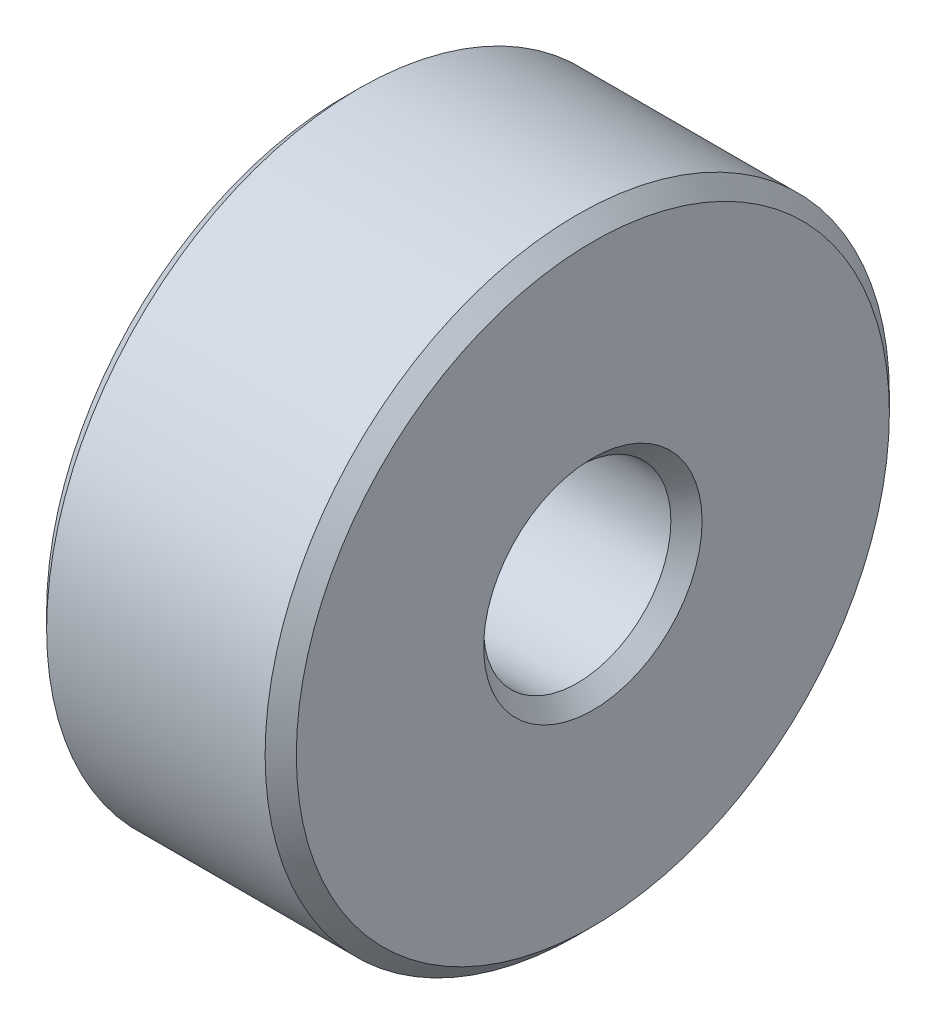
ISO-10303-21;
HEADER;
FILE_DESCRIPTION(('STEP AP214'),'2;1');
FILE_NAME('part.step','',(''),(''),'','','');
FILE_SCHEMA(('AUTOMOTIVE_DESIGN { 1 0 10303 214 1 1 1 1 }'));
ENDSEC;
DATA;
#1=APPLICATION_CONTEXT('core data for automotive mechanical design processes');
#2=APPLICATION_PROTOCOL_DEFINITION('international standard','automotive_design',2000,#1);
#3=PRODUCT_CONTEXT('',#1,'mechanical');
#4=PRODUCT('Part','Part','',(#3));
#5=PRODUCT_RELATED_PRODUCT_CATEGORY('part','',(#4));
#6=PRODUCT_DEFINITION_FORMATION('','',#4);
#7=PRODUCT_DEFINITION_CONTEXT('part definition',#1,'design');
#8=PRODUCT_DEFINITION('design','',#6,#7);
#9=PRODUCT_DEFINITION_SHAPE('','',#8);
#10=(LENGTH_UNIT() NAMED_UNIT(*) SI_UNIT(.MILLI.,.METRE.));
#11=(NAMED_UNIT(*) PLANE_ANGLE_UNIT() SI_UNIT($,.RADIAN.));
#12=(NAMED_UNIT(*) SI_UNIT($,.STERADIAN.) SOLID_ANGLE_UNIT());
#13=UNCERTAINTY_MEASURE_WITH_UNIT(LENGTH_MEASURE(1.E-05),#10,'distance_accuracy_value','');
#14=(GEOMETRIC_REPRESENTATION_CONTEXT(3) GLOBAL_UNCERTAINTY_ASSIGNED_CONTEXT((#13)) GLOBAL_UNIT_ASSIGNED_CONTEXT((#10,
#11,#12)) REPRESENTATION_CONTEXT('',''));
#15=CARTESIAN_POINT('',(0.,0.,0.));
#16=DIRECTION('',(0.,0.,1.));
#17=DIRECTION('',(1.,0.,0.));
#18=AXIS2_PLACEMENT_3D('',#15,#16,#17);
#19=CARTESIAN_POINT('',(2.,0.,0.));
#20=DIRECTION('',(1.,0.,0.));
#21=DIRECTION('',(0.,0.,-1.));
#22=AXIS2_PLACEMENT_3D('',#19,#20,#21);
#23=PLANE('',#22);
#24=CARTESIAN_POINT('',(2.,0.,0.));
#25=DIRECTION('',(1.,0.,0.));
#26=DIRECTION('',(0.,0.,-1.));
#27=AXIS2_PLACEMENT_3D('',#24,#25,#26);
#28=CIRCLE('',#27,1.75);
#29=CARTESIAN_POINT('',(2.,0.,-1.75));
#30=VERTEX_POINT('',#29);
#31=EDGE_CURVE('E55',#30,#30,#28,.F.);
#32=ORIENTED_EDGE('',*,*,#31,.T.);
#33=EDGE_LOOP('',(#32));
#34=FACE_BOUND('',#33,.T.);
#35=CARTESIAN_POINT('',(2.,0.,0.));
#36=DIRECTION('',(1.,0.,0.));
#37=DIRECTION('',(0.,0.,-1.));
#38=AXIS2_PLACEMENT_3D('',#35,#36,#37);
#39=CIRCLE('',#38,4.75);
#40=CARTESIAN_POINT('',(2.,0.,-4.75));
#41=VERTEX_POINT('',#40);
#42=EDGE_CURVE('E60',#41,#41,#39,.T.);
#43=ORIENTED_EDGE('',*,*,#42,.T.);
#44=EDGE_LOOP('',(#43));
#45=FACE_BOUND('',#44,.T.);
#46=ADVANCED_FACE('F39',(#34,#45),#23,.T.);
#47=CARTESIAN_POINT('',(-2.,0.,0.));
#48=DIRECTION('',(1.,0.,0.));
#49=DIRECTION('',(0.,0.,-1.));
#50=AXIS2_PLACEMENT_3D('',#47,#48,#49);
#51=PLANE('',#50);
#52=CARTESIAN_POINT('',(-2.,0.,0.));
#53=DIRECTION('',(1.,0.,0.));
#54=DIRECTION('',(0.,0.,-1.));
#55=AXIS2_PLACEMENT_3D('',#52,#53,#54);
#56=CIRCLE('',#55,4.75);
#57=CARTESIAN_POINT('',(-2.,0.,-4.75));
#58=VERTEX_POINT('',#57);
#59=EDGE_CURVE('E10',#58,#58,#56,.F.);
#60=ORIENTED_EDGE('',*,*,#59,.T.);
#61=EDGE_LOOP('',(#60));
#62=FACE_BOUND('',#61,.T.);
#63=CARTESIAN_POINT('',(-2.,0.,0.));
#64=DIRECTION('',(1.,0.,0.));
#65=DIRECTION('',(0.,0.,-1.));
#66=AXIS2_PLACEMENT_3D('',#63,#64,#65);
#67=CIRCLE('',#66,1.5);
#68=CARTESIAN_POINT('',(-2.,0.,-1.5));
#69=VERTEX_POINT('',#68);
#70=EDGE_CURVE('E66',#69,#69,#67,.T.);
#71=ORIENTED_EDGE('',*,*,#70,.T.);
#72=EDGE_LOOP('',(#71));
#73=FACE_BOUND('',#72,.T.);
#74=ADVANCED_FACE('F70',(#62,#73),#51,.F.);
#75=CARTESIAN_POINT('',(2.,0.,0.));
#76=DIRECTION('',(-1.,0.,0.));
#77=DIRECTION('',(0.,0.,1.));
#78=AXIS2_PLACEMENT_3D('',#75,#76,#77);
#79=CYLINDRICAL_SURFACE('',#78,5.);
#80=CARTESIAN_POINT('',(-1.75,0.,0.));
#81=DIRECTION('',(1.,0.,0.));
#82=DIRECTION('',(0.,0.,-1.));
#83=AXIS2_PLACEMENT_3D('',#80,#81,#82);
#84=CIRCLE('',#83,5.);
#85=CARTESIAN_POINT('',(-1.75,0.,-5.));
#86=VERTEX_POINT('',#85);
#87=EDGE_CURVE('E47',#86,#86,#84,.T.);
#88=ORIENTED_EDGE('',*,*,#87,.T.);
#89=EDGE_LOOP('',(#88));
#90=FACE_BOUND('',#89,.T.);
#91=CARTESIAN_POINT('',(1.75,0.,0.));
#92=DIRECTION('',(1.,0.,0.));
#93=DIRECTION('',(0.,0.,-1.));
#94=AXIS2_PLACEMENT_3D('',#91,#92,#93);
#95=CIRCLE('',#94,5.);
#96=CARTESIAN_POINT('',(1.75,0.,-5.));
#97=VERTEX_POINT('',#96);
#98=EDGE_CURVE('E51',#97,#97,#95,.F.);
#99=ORIENTED_EDGE('',*,*,#98,.T.);
#100=EDGE_LOOP('',(#99));
#101=FACE_BOUND('',#100,.T.);
#102=ADVANCED_FACE('F75',(#90,#101),#79,.T.);
#103=CARTESIAN_POINT('',(2.,0.,0.));
#104=DIRECTION('',(-1.,0.,0.));
#105=DIRECTION('',(0.,0.,1.));
#106=AXIS2_PLACEMENT_3D('',#103,#104,#105);
#107=CYLINDRICAL_SURFACE('',#106,1.5);
#108=CARTESIAN_POINT('',(1.75,0.,0.));
#109=DIRECTION('',(1.,0.,0.));
#110=DIRECTION('',(0.,0.,-1.));
#111=AXIS2_PLACEMENT_3D('',#108,#109,#110);
#112=CIRCLE('',#111,1.5);
#113=CARTESIAN_POINT('',(1.75,0.,-1.5));
#114=VERTEX_POINT('',#113);
#115=EDGE_CURVE('E63',#114,#114,#112,.T.);
#116=ORIENTED_EDGE('',*,*,#115,.T.);
#117=EDGE_LOOP('',(#116));
#118=FACE_BOUND('',#117,.T.);
#119=ORIENTED_EDGE('',*,*,#70,.F.);
#120=EDGE_LOOP('',(#119));
#121=FACE_BOUND('',#120,.T.);
#122=ADVANCED_FACE('F72',(#118,#121),#107,.F.);
#123=CARTESIAN_POINT('',(1.75,0.,0.));
#124=DIRECTION('',(1.,0.,0.));
#125=DIRECTION('',(0.,0.,-1.));
#126=AXIS2_PLACEMENT_3D('',#123,#124,#125);
#127=CONICAL_SURFACE('',#126,1.5,0.785398163397448);
#128=ORIENTED_EDGE('',*,*,#31,.F.);
#129=EDGE_LOOP('',(#128));
#130=FACE_BOUND('',#129,.T.);
#131=ORIENTED_EDGE('',*,*,#115,.F.);
#132=EDGE_LOOP('',(#131));
#133=FACE_BOUND('',#132,.T.);
#134=ADVANCED_FACE('F74',(#130,#133),#127,.F.);
#135=CARTESIAN_POINT('',(-1.75,0.,0.));
#136=DIRECTION('',(1.,0.,0.));
#137=DIRECTION('',(0.,0.,-1.));
#138=AXIS2_PLACEMENT_3D('',#135,#136,#137);
#139=CONICAL_SURFACE('',#138,5.,0.78539816339745);
#140=ORIENTED_EDGE('',*,*,#59,.F.);
#141=EDGE_LOOP('',(#140));
#142=FACE_BOUND('',#141,.T.);
#143=ORIENTED_EDGE('',*,*,#87,.F.);
#144=EDGE_LOOP('',(#143));
#145=FACE_BOUND('',#144,.T.);
#146=ADVANCED_FACE('F82',(#142,#145),#139,.T.);
#147=CARTESIAN_POINT('',(2.,0.,0.));
#148=DIRECTION('',(-1.,0.,0.));
#149=DIRECTION('',(0.,0.,1.));
#150=AXIS2_PLACEMENT_3D('',#147,#148,#149);
#151=CONICAL_SURFACE('',#150,4.75,0.785398163397441);
#152=ORIENTED_EDGE('',*,*,#98,.F.);
#153=EDGE_LOOP('',(#152));
#154=FACE_BOUND('',#153,.T.);
#155=ORIENTED_EDGE('',*,*,#42,.F.);
#156=EDGE_LOOP('',(#155));
#157=FACE_BOUND('',#156,.T.);
#158=ADVANCED_FACE('F42',(#154,#157),#151,.T.);
#159=CLOSED_SHELL('',(#46,#74,#102,#122,#134,#146,#158));
#160=MANIFOLD_SOLID_BREP('B2',#159);
#161=ADVANCED_BREP_SHAPE_REPRESENTATION('',(#18,#160),#14);
#162=SHAPE_DEFINITION_REPRESENTATION(#9,#161);
ENDSEC;
END-ISO-10303-21;
